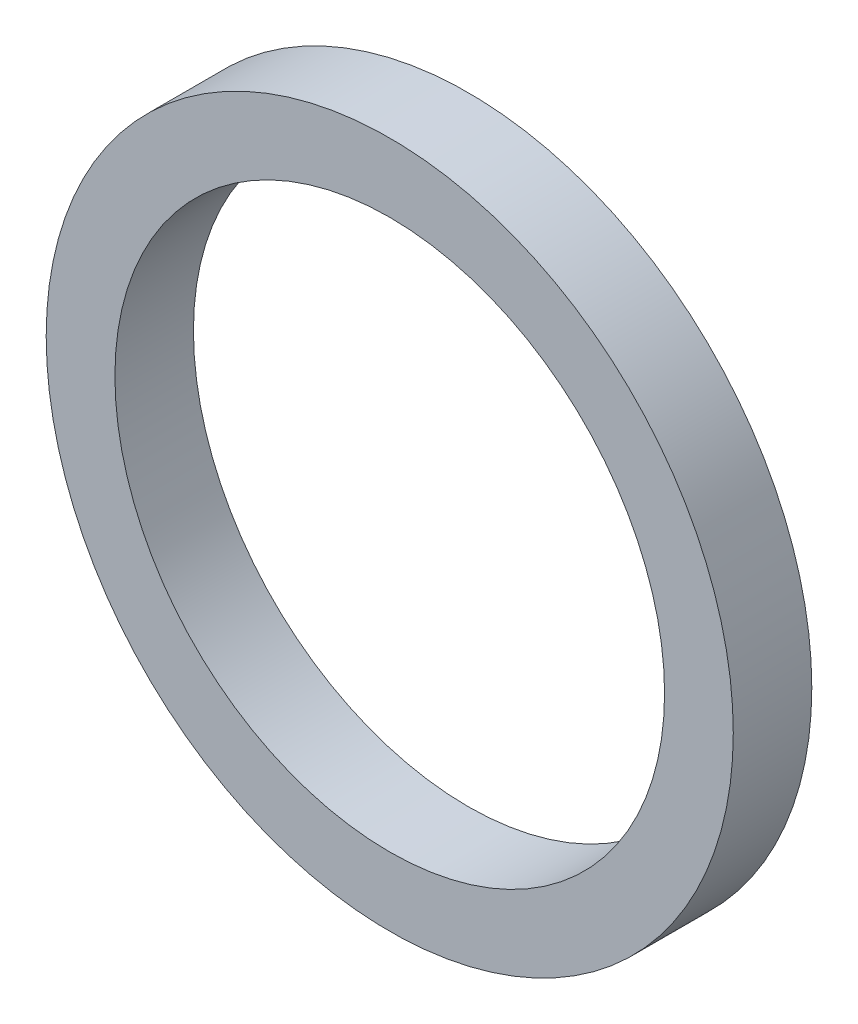
ISO-10303-21;
HEADER;
FILE_DESCRIPTION(('STEP AP214'),'2;1');
FILE_NAME('part.step','',(''),(''),'','','');
FILE_SCHEMA(('AUTOMOTIVE_DESIGN { 1 0 10303 214 1 1 1 1 }'));
ENDSEC;
DATA;
#1=APPLICATION_CONTEXT('core data for automotive mechanical design processes');
#2=APPLICATION_PROTOCOL_DEFINITION('international standard','automotive_design',2000,#1);
#3=PRODUCT_CONTEXT('',#1,'mechanical');
#4=PRODUCT('Part','Part','',(#3));
#5=PRODUCT_RELATED_PRODUCT_CATEGORY('part','',(#4));
#6=PRODUCT_DEFINITION_FORMATION('','',#4);
#7=PRODUCT_DEFINITION_CONTEXT('part definition',#1,'design');
#8=PRODUCT_DEFINITION('design','',#6,#7);
#9=PRODUCT_DEFINITION_SHAPE('','',#8);
#10=(LENGTH_UNIT() NAMED_UNIT(*) SI_UNIT(.MILLI.,.METRE.));
#11=(NAMED_UNIT(*) PLANE_ANGLE_UNIT() SI_UNIT($,.RADIAN.));
#12=(NAMED_UNIT(*) SI_UNIT($,.STERADIAN.) SOLID_ANGLE_UNIT());
#13=UNCERTAINTY_MEASURE_WITH_UNIT(LENGTH_MEASURE(1.E-05),#10,'distance_accuracy_value','');
#14=(GEOMETRIC_REPRESENTATION_CONTEXT(3) GLOBAL_UNCERTAINTY_ASSIGNED_CONTEXT((#13)) GLOBAL_UNIT_ASSIGNED_CONTEXT((#10,
#11,#12)) REPRESENTATION_CONTEXT('',''));
#15=CARTESIAN_POINT('',(0.,0.,0.));
#16=DIRECTION('',(0.,0.,1.));
#17=DIRECTION('',(1.,0.,0.));
#18=AXIS2_PLACEMENT_3D('',#15,#16,#17);
#19=CARTESIAN_POINT('',(0.,0.,4.));
#20=DIRECTION('',(0.,0.,1.));
#21=DIRECTION('',(1.,0.,0.));
#22=AXIS2_PLACEMENT_3D('',#19,#20,#21);
#23=PLANE('',#22);
#24=CARTESIAN_POINT('',(0.,0.,4.));
#25=DIRECTION('',(0.,0.,1.));
#26=DIRECTION('',(1.,0.,0.));
#27=AXIS2_PLACEMENT_3D('',#24,#25,#26);
#28=CIRCLE('',#27,17.5);
#29=CARTESIAN_POINT('',(17.5,0.,4.));
#30=VERTEX_POINT('',#29);
#31=EDGE_CURVE('E10',#30,#30,#28,.T.);
#32=ORIENTED_EDGE('',*,*,#31,.T.);
#33=EDGE_LOOP('',(#32));
#34=FACE_BOUND('',#33,.T.);
#35=CARTESIAN_POINT('',(0.,0.,4.));
#36=DIRECTION('',(0.,0.,1.));
#37=DIRECTION('',(1.,0.,0.));
#38=AXIS2_PLACEMENT_3D('',#35,#36,#37);
#39=CIRCLE('',#38,14.);
#40=CARTESIAN_POINT('',(14.,0.,4.));
#41=VERTEX_POINT('',#40);
#42=EDGE_CURVE('E50',#41,#41,#39,.T.);
#43=ORIENTED_EDGE('',*,*,#42,.F.);
#44=EDGE_LOOP('',(#43));
#45=FACE_BOUND('',#44,.T.);
#46=ADVANCED_FACE('F39',(#34,#45),#23,.T.);
#47=CARTESIAN_POINT('',(0.,0.,0.));
#48=DIRECTION('',(0.,0.,1.));
#49=DIRECTION('',(1.,0.,0.));
#50=AXIS2_PLACEMENT_3D('',#47,#48,#49);
#51=PLANE('',#50);
#52=CARTESIAN_POINT('',(0.,0.,0.));
#53=DIRECTION('',(0.,0.,1.));
#54=DIRECTION('',(1.,0.,0.));
#55=AXIS2_PLACEMENT_3D('',#52,#53,#54);
#56=CIRCLE('',#55,17.5);
#57=CARTESIAN_POINT('',(17.5,0.,0.));
#58=VERTEX_POINT('',#57);
#59=EDGE_CURVE('E43',#58,#58,#56,.T.);
#60=ORIENTED_EDGE('',*,*,#59,.F.);
#61=EDGE_LOOP('',(#60));
#62=FACE_BOUND('',#61,.T.);
#63=CARTESIAN_POINT('',(0.,0.,0.));
#64=DIRECTION('',(0.,0.,1.));
#65=DIRECTION('',(1.,0.,0.));
#66=AXIS2_PLACEMENT_3D('',#63,#64,#65);
#67=CIRCLE('',#66,14.);
#68=CARTESIAN_POINT('',(14.,0.,0.));
#69=VERTEX_POINT('',#68);
#70=EDGE_CURVE('E52',#69,#69,#67,.T.);
#71=ORIENTED_EDGE('',*,*,#70,.T.);
#72=EDGE_LOOP('',(#71));
#73=FACE_BOUND('',#72,.T.);
#74=ADVANCED_FACE('F62',(#62,#73),#51,.F.);
#75=CARTESIAN_POINT('',(0.,0.,4.));
#76=DIRECTION('',(0.,0.,-1.));
#77=DIRECTION('',(-1.,0.,0.));
#78=AXIS2_PLACEMENT_3D('',#75,#76,#77);
#79=CYLINDRICAL_SURFACE('',#78,17.5);
#80=ORIENTED_EDGE('',*,*,#31,.F.);
#81=EDGE_LOOP('',(#80));
#82=FACE_BOUND('',#81,.T.);
#83=ORIENTED_EDGE('',*,*,#59,.T.);
#84=EDGE_LOOP('',(#83));
#85=FACE_BOUND('',#84,.T.);
#86=ADVANCED_FACE('F41',(#82,#85),#79,.T.);
#87=CARTESIAN_POINT('',(0.,0.,4.));
#88=DIRECTION('',(0.,0.,-1.));
#89=DIRECTION('',(-1.,0.,0.));
#90=AXIS2_PLACEMENT_3D('',#87,#88,#89);
#91=CYLINDRICAL_SURFACE('',#90,14.);
#92=ORIENTED_EDGE('',*,*,#42,.T.);
#93=EDGE_LOOP('',(#92));
#94=FACE_BOUND('',#93,.T.);
#95=ORIENTED_EDGE('',*,*,#70,.F.);
#96=EDGE_LOOP('',(#95));
#97=FACE_BOUND('',#96,.T.);
#98=ADVANCED_FACE('F58',(#94,#97),#91,.F.);
#99=CLOSED_SHELL('',(#46,#74,#86,#98));
#100=MANIFOLD_SOLID_BREP('B2',#99);
#101=ADVANCED_BREP_SHAPE_REPRESENTATION('',(#18,#100),#14);
#102=SHAPE_DEFINITION_REPRESENTATION(#9,#101);
ENDSEC;
END-ISO-10303-21;
